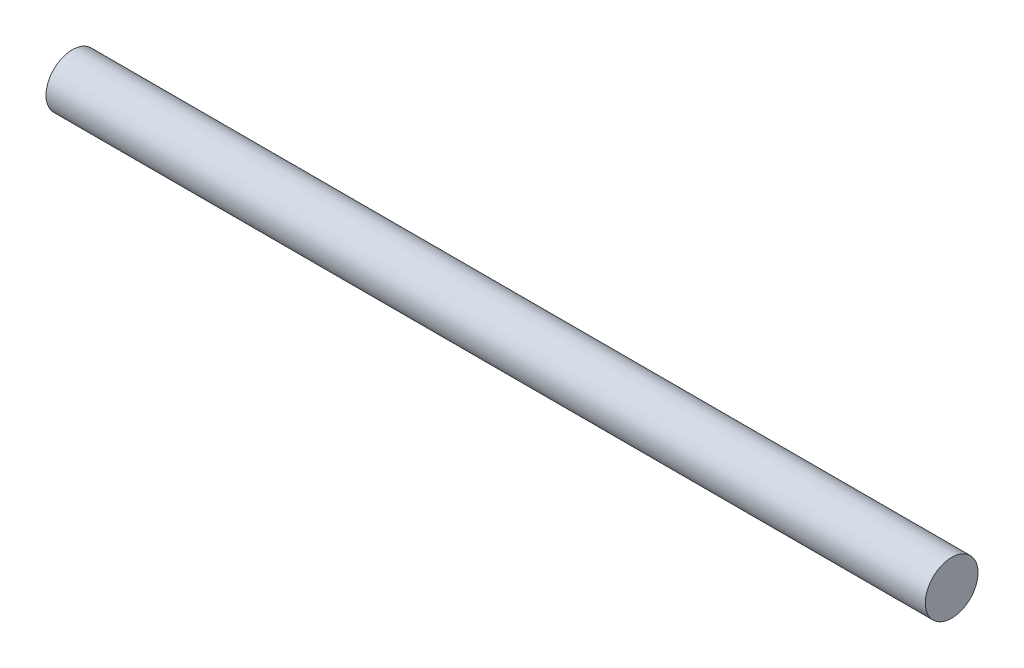
ISO-10303-21;
HEADER;
FILE_DESCRIPTION(('STEP AP214'),'2;1');
FILE_NAME('part.step','',(''),(''),'','','');
FILE_SCHEMA(('AUTOMOTIVE_DESIGN { 1 0 10303 214 1 1 1 1 }'));
ENDSEC;
DATA;
#1=APPLICATION_CONTEXT('core data for automotive mechanical design processes');
#2=APPLICATION_PROTOCOL_DEFINITION('international standard','automotive_design',2000,#1);
#3=PRODUCT_CONTEXT('',#1,'mechanical');
#4=PRODUCT('Part','Part','',(#3));
#5=PRODUCT_RELATED_PRODUCT_CATEGORY('part','',(#4));
#6=PRODUCT_DEFINITION_FORMATION('','',#4);
#7=PRODUCT_DEFINITION_CONTEXT('part definition',#1,'design');
#8=PRODUCT_DEFINITION('design','',#6,#7);
#9=PRODUCT_DEFINITION_SHAPE('','',#8);
#10=(LENGTH_UNIT() NAMED_UNIT(*) SI_UNIT(.MILLI.,.METRE.));
#11=(NAMED_UNIT(*) PLANE_ANGLE_UNIT() SI_UNIT($,.RADIAN.));
#12=(NAMED_UNIT(*) SI_UNIT($,.STERADIAN.) SOLID_ANGLE_UNIT());
#13=UNCERTAINTY_MEASURE_WITH_UNIT(LENGTH_MEASURE(1.E-05),#10,'distance_accuracy_value','');
#14=(GEOMETRIC_REPRESENTATION_CONTEXT(3) GLOBAL_UNCERTAINTY_ASSIGNED_CONTEXT((#13)) GLOBAL_UNIT_ASSIGNED_CONTEXT((#10,
#11,#12)) REPRESENTATION_CONTEXT('',''));
#15=CARTESIAN_POINT('',(0.,0.,0.));
#16=DIRECTION('',(0.,0.,1.));
#17=DIRECTION('',(1.,0.,0.));
#18=AXIS2_PLACEMENT_3D('',#15,#16,#17);
#19=CARTESIAN_POINT('',(-46.0574503889658,2.286,0.));
#20=DIRECTION('',(-1.,0.,0.));
#21=DIRECTION('',(0.,0.,1.));
#22=AXIS2_PLACEMENT_3D('',#19,#20,#21);
#23=PLANE('',#22);
#24=CARTESIAN_POINT('',(-46.0574503889658,2.286,0.));
#25=DIRECTION('',(-1.,0.,0.));
#26=DIRECTION('',(0.,0.,1.));
#27=AXIS2_PLACEMENT_3D('',#24,#25,#26);
#28=CIRCLE('',#27,2.286);
#29=CARTESIAN_POINT('',(-46.0574503889658,2.286,2.286));
#30=VERTEX_POINT('',#29);
#31=EDGE_CURVE('E10',#30,#30,#28,.T.);
#32=ORIENTED_EDGE('',*,*,#31,.T.);
#33=EDGE_LOOP('',(#32));
#34=FACE_BOUND('',#33,.T.);
#35=ADVANCED_FACE('F37',(#34),#23,.T.);
#36=CARTESIAN_POINT('',(-46.0574503889658,2.286,0.));
#37=DIRECTION('',(-1.,0.,0.));
#38=DIRECTION('',(0.,0.,1.));
#39=AXIS2_PLACEMENT_3D('',#36,#37,#38);
#40=CYLINDRICAL_SURFACE('',#39,2.286);
#41=CARTESIAN_POINT('',(30.1425496110342,2.286,0.));
#42=DIRECTION('',(-1.,0.,0.));
#43=DIRECTION('',(0.,0.,1.));
#44=AXIS2_PLACEMENT_3D('',#41,#42,#43);
#45=CIRCLE('',#44,2.286);
#46=CARTESIAN_POINT('',(30.1425496110342,2.286,2.286));
#47=VERTEX_POINT('',#46);
#48=EDGE_CURVE('E44',#47,#47,#45,.T.);
#49=ORIENTED_EDGE('',*,*,#48,.T.);
#50=EDGE_LOOP('',(#49));
#51=FACE_BOUND('',#50,.T.);
#52=ORIENTED_EDGE('',*,*,#31,.F.);
#53=EDGE_LOOP('',(#52));
#54=FACE_BOUND('',#53,.T.);
#55=ADVANCED_FACE('F51',(#51,#54),#40,.T.);
#56=CARTESIAN_POINT('',(30.1425496110342,2.286,0.));
#57=DIRECTION('',(1.,0.,0.));
#58=DIRECTION('',(0.,0.,-1.));
#59=AXIS2_PLACEMENT_3D('',#56,#57,#58);
#60=PLANE('',#59);
#61=ORIENTED_EDGE('',*,*,#48,.F.);
#62=EDGE_LOOP('',(#61));
#63=FACE_BOUND('',#62,.T.);
#64=ADVANCED_FACE('F54',(#63),#60,.T.);
#65=CLOSED_SHELL('',(#35,#55,#64));
#66=MANIFOLD_SOLID_BREP('B2',#65);
#67=ADVANCED_BREP_SHAPE_REPRESENTATION('',(#18,#66),#14);
#68=SHAPE_DEFINITION_REPRESENTATION(#9,#67);
ENDSEC;
END-ISO-10303-21;
